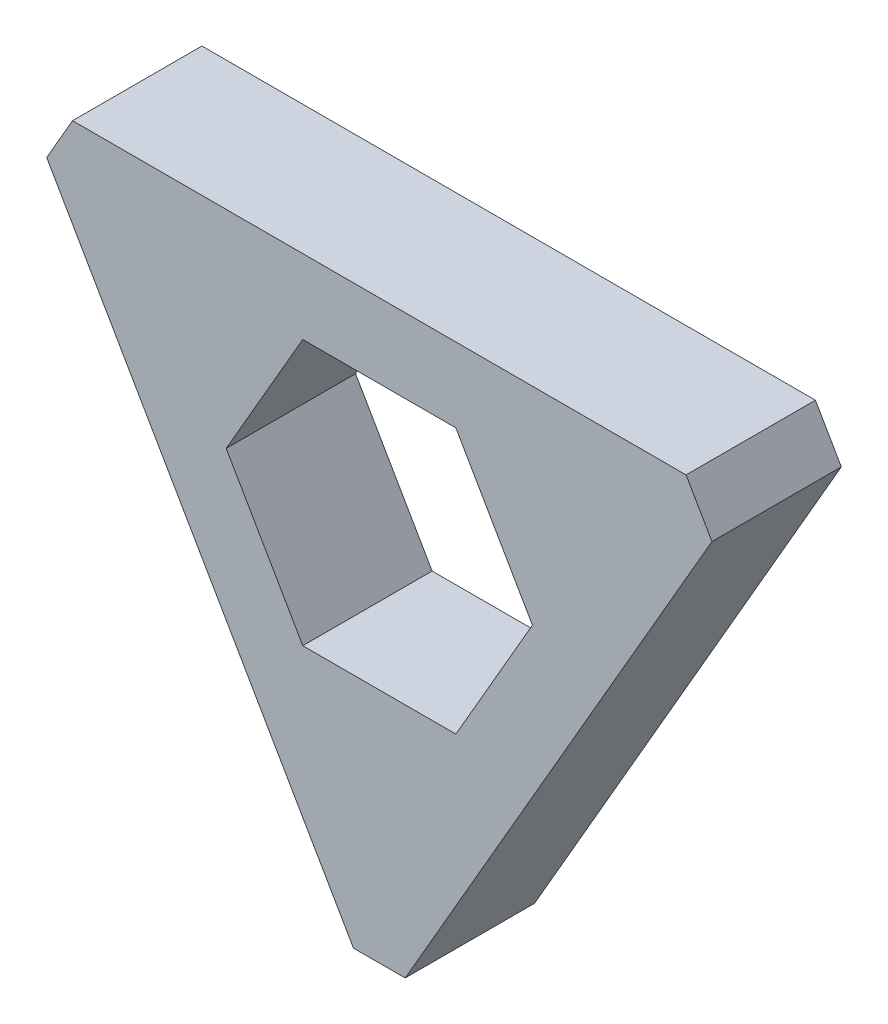
ISO-10303-21;
HEADER;
FILE_DESCRIPTION(('STEP AP214'),'2;1');
FILE_NAME('part.step','',(''),(''),'','','');
FILE_SCHEMA(('AUTOMOTIVE_DESIGN { 1 0 10303 214 1 1 1 1 }'));
ENDSEC;
DATA;
#1=APPLICATION_CONTEXT('core data for automotive mechanical design processes');
#2=APPLICATION_PROTOCOL_DEFINITION('international standard','automotive_design',2000,#1);
#3=PRODUCT_CONTEXT('',#1,'mechanical');
#4=PRODUCT('Part','Part','',(#3));
#5=PRODUCT_RELATED_PRODUCT_CATEGORY('part','',(#4));
#6=PRODUCT_DEFINITION_FORMATION('','',#4);
#7=PRODUCT_DEFINITION_CONTEXT('part definition',#1,'design');
#8=PRODUCT_DEFINITION('design','',#6,#7);
#9=PRODUCT_DEFINITION_SHAPE('','',#8);
#10=(LENGTH_UNIT() NAMED_UNIT(*) SI_UNIT(.MILLI.,.METRE.));
#11=(NAMED_UNIT(*) PLANE_ANGLE_UNIT() SI_UNIT($,.RADIAN.));
#12=(NAMED_UNIT(*) SI_UNIT($,.STERADIAN.) SOLID_ANGLE_UNIT());
#13=UNCERTAINTY_MEASURE_WITH_UNIT(LENGTH_MEASURE(1.E-05),#10,'distance_accuracy_value','');
#14=(GEOMETRIC_REPRESENTATION_CONTEXT(3) GLOBAL_UNCERTAINTY_ASSIGNED_CONTEXT((#13)) GLOBAL_UNIT_ASSIGNED_CONTEXT((#10,
#11,#12)) REPRESENTATION_CONTEXT('',''));
#15=CARTESIAN_POINT('',(0.,0.,0.));
#16=DIRECTION('',(0.,0.,1.));
#17=DIRECTION('',(1.,0.,0.));
#18=AXIS2_PLACEMENT_3D('',#15,#16,#17);
#19=CARTESIAN_POINT('',(0.,0.,-180.));
#20=DIRECTION('',(0.,0.,-1.));
#21=DIRECTION('',(-1.,0.,0.));
#22=AXIS2_PLACEMENT_3D('',#19,#20,#21);
#23=PLANE('',#22);
#24=DIRECTION('',(-0.5,-0.866025403784439,0.));
#25=VECTOR('',#24,1.);
#26=CARTESIAN_POINT('',(23.6713610367747,0.,-180.));
#27=LINE('',#26,#25);
#28=CARTESIAN_POINT('',(23.6713610367747,0.,-180.));
#29=VERTEX_POINT('',#28);
#30=CARTESIAN_POINT('',(11.8356805183873,-20.5,-180.));
#31=VERTEX_POINT('',#30);
#32=EDGE_CURVE('E224',#29,#31,#27,.T.);
#33=ORIENTED_EDGE('',*,*,#32,.T.);
#34=DIRECTION('',(-1.,0.,0.));
#35=VECTOR('',#34,1.);
#36=CARTESIAN_POINT('',(11.8356805183873,-20.5,-180.));
#37=LINE('',#36,#35);
#38=CARTESIAN_POINT('',(-11.8356805183873,-20.5,-180.));
#39=VERTEX_POINT('',#38);
#40=EDGE_CURVE('E227',#31,#39,#37,.T.);
#41=ORIENTED_EDGE('',*,*,#40,.T.);
#42=DIRECTION('',(-0.5,0.866025403784438,0.));
#43=VECTOR('',#42,1.);
#44=CARTESIAN_POINT('',(-11.8356805183873,-20.5,-180.));
#45=LINE('',#44,#43);
#46=CARTESIAN_POINT('',(-23.6713610367747,0.,-180.));
#47=VERTEX_POINT('',#46);
#48=EDGE_CURVE('E230',#39,#47,#45,.T.);
#49=ORIENTED_EDGE('',*,*,#48,.T.);
#50=DIRECTION('',(0.5,0.866025403784439,0.));
#51=VECTOR('',#50,1.);
#52=CARTESIAN_POINT('',(-23.6713610367747,0.,-180.));
#53=LINE('',#52,#51);
#54=CARTESIAN_POINT('',(-11.8356805183874,20.5,-180.));
#55=VERTEX_POINT('',#54);
#56=EDGE_CURVE('E233',#47,#55,#53,.T.);
#57=ORIENTED_EDGE('',*,*,#56,.T.);
#58=DIRECTION('',(1.,0.,0.));
#59=VECTOR('',#58,1.);
#60=CARTESIAN_POINT('',(-11.8356805183874,20.5,-180.));
#61=LINE('',#60,#59);
#62=CARTESIAN_POINT('',(11.8356805183873,20.5,-180.));
#63=VERTEX_POINT('',#62);
#64=EDGE_CURVE('E236',#55,#63,#61,.T.);
#65=ORIENTED_EDGE('',*,*,#64,.T.);
#66=DIRECTION('',(0.5,-0.866025403784439,0.));
#67=VECTOR('',#66,1.);
#68=CARTESIAN_POINT('',(11.8356805183873,20.5,-180.));
#69=LINE('',#68,#67);
#70=EDGE_CURVE('E239',#63,#29,#69,.T.);
#71=ORIENTED_EDGE('',*,*,#70,.T.);
#72=EDGE_LOOP('',(#33,#41,#49,#57,#65,#71));
#73=FACE_BOUND('',#72,.T.);
#74=DIRECTION('',(0.500000000000001,0.866025403784438,0.));
#75=VECTOR('',#74,1.);
#76=CARTESIAN_POINT('',(4.00002711889661,-57.0720970525392,-180.));
#77=LINE('',#76,#75);
#78=CARTESIAN_POINT('',(4.00002711889663,-57.0720970525392,-180.));
#79=VERTEX_POINT('',#78);
#80=CARTESIAN_POINT('',(51.4258100782776,25.0717686218424,-180.));
#81=VERTEX_POINT('',#80);
#82=EDGE_CURVE('E147',#79,#81,#77,.T.);
#83=ORIENTED_EDGE('',*,*,#82,.T.);
#84=DIRECTION('',(-0.499999910244853,0.866025455604591,0.));
#85=VECTOR('',#84,1.);
#86=CARTESIAN_POINT('',(47.4258047104851,31.9999828076548,-180.));
#87=LINE('',#86,#85);
#88=CARTESIAN_POINT('',(47.4258047104851,31.9999828076548,-180.));
#89=VERTEX_POINT('',#88);
#90=EDGE_CURVE('E142',#81,#89,#87,.T.);
#91=ORIENTED_EDGE('',*,*,#90,.T.);
#92=DIRECTION('',(-1.,0.,0.));
#93=VECTOR('',#92,1.);
#94=CARTESIAN_POINT('',(47.4258047104851,31.9999828076548,-180.));
#95=LINE('',#94,#93);
#96=CARTESIAN_POINT('',(-47.4255638428803,31.9999828076547,-180.));
#97=VERTEX_POINT('',#96);
#98=EDGE_CURVE('E140',#89,#97,#95,.T.);
#99=ORIENTED_EDGE('',*,*,#98,.T.);
#100=DIRECTION('',(-0.500034807579477,-0.866005306686371,0.));
#101=VECTOR('',#100,1.);
#102=CARTESIAN_POINT('',(-51.4258483825629,25.0719298259231,-180.));
#103=LINE('',#102,#101);
#104=CARTESIAN_POINT('',(-51.4258483825629,25.0719298259231,-180.));
#105=VERTEX_POINT('',#104);
#106=EDGE_CURVE('E47',#97,#105,#103,.T.);
#107=ORIENTED_EDGE('',*,*,#106,.T.);
#108=DIRECTION('',(0.5,-0.866025403784438,0.));
#109=VECTOR('',#108,1.);
#110=CARTESIAN_POINT('',(-51.4258483825629,25.0719298259231,-180.));
#111=LINE('',#110,#109);
#112=CARTESIAN_POINT('',(-3.99997235196278,-57.0720970525392,-180.));
#113=VERTEX_POINT('',#112);
#114=EDGE_CURVE('E222',#105,#113,#111,.T.);
#115=ORIENTED_EDGE('',*,*,#114,.T.);
#116=DIRECTION('',(1.,0.,0.));
#117=VECTOR('',#116,1.);
#118=CARTESIAN_POINT('',(4.00002711889663,-57.0720970525392,-180.));
#119=LINE('',#118,#117);
#120=EDGE_CURVE('E138',#113,#79,#119,.T.);
#121=ORIENTED_EDGE('',*,*,#120,.T.);
#122=EDGE_LOOP('',(#83,#91,#99,#107,#115,#121));
#123=FACE_BOUND('',#122,.T.);
#124=ADVANCED_FACE('F43',(#73,#123),#23,.F.);
#125=CARTESIAN_POINT('',(0.,0.,-200.));
#126=DIRECTION('',(0.,0.,-1.));
#127=DIRECTION('',(-1.,0.,0.));
#128=AXIS2_PLACEMENT_3D('',#125,#126,#127);
#129=PLANE('',#128);
#130=DIRECTION('',(0.500000000000001,0.866025403784438,0.));
#131=VECTOR('',#130,1.);
#132=CARTESIAN_POINT('',(4.00002711889661,-57.0720970525392,-200.));
#133=LINE('',#132,#131);
#134=CARTESIAN_POINT('',(4.00002711889663,-57.0720970525392,-200.));
#135=VERTEX_POINT('',#134);
#136=CARTESIAN_POINT('',(51.4258100782776,25.0717686218424,-200.));
#137=VERTEX_POINT('',#136);
#138=EDGE_CURVE('E151',#135,#137,#133,.T.);
#139=ORIENTED_EDGE('',*,*,#138,.F.);
#140=DIRECTION('',(1.,0.,0.));
#141=VECTOR('',#140,1.);
#142=CARTESIAN_POINT('',(4.00002711889663,-57.0720970525392,-200.));
#143=LINE('',#142,#141);
#144=CARTESIAN_POINT('',(-3.99997235196278,-57.0720970525392,-200.));
#145=VERTEX_POINT('',#144);
#146=EDGE_CURVE('E178',#145,#135,#143,.T.);
#147=ORIENTED_EDGE('',*,*,#146,.F.);
#148=DIRECTION('',(0.5,-0.866025403784438,0.));
#149=VECTOR('',#148,1.);
#150=CARTESIAN_POINT('',(-51.4258483825629,25.0719298259231,-200.));
#151=LINE('',#150,#149);
#152=CARTESIAN_POINT('',(-51.4258483825629,25.0719298259231,-200.));
#153=VERTEX_POINT('',#152);
#154=EDGE_CURVE('E154',#153,#145,#151,.T.);
#155=ORIENTED_EDGE('',*,*,#154,.F.);
#156=DIRECTION('',(-0.500034807579477,-0.866005306686371,0.));
#157=VECTOR('',#156,1.);
#158=CARTESIAN_POINT('',(-51.4258483825629,25.0719298259231,-200.));
#159=LINE('',#158,#157);
#160=CARTESIAN_POINT('',(-47.4255638428803,31.9999828076547,-200.));
#161=VERTEX_POINT('',#160);
#162=EDGE_CURVE('E61',#161,#153,#159,.T.);
#163=ORIENTED_EDGE('',*,*,#162,.F.);
#164=DIRECTION('',(-1.,0.,0.));
#165=VECTOR('',#164,1.);
#166=CARTESIAN_POINT('',(47.4258047104851,31.9999828076548,-200.));
#167=LINE('',#166,#165);
#168=CARTESIAN_POINT('',(47.4258047104851,31.9999828076548,-200.));
#169=VERTEX_POINT('',#168);
#170=EDGE_CURVE('E146',#169,#161,#167,.T.);
#171=ORIENTED_EDGE('',*,*,#170,.F.);
#172=DIRECTION('',(-0.499999910244853,0.866025455604591,0.));
#173=VECTOR('',#172,1.);
#174=CARTESIAN_POINT('',(47.4258047104851,31.9999828076548,-200.));
#175=LINE('',#174,#173);
#176=EDGE_CURVE('E176',#137,#169,#175,.T.);
#177=ORIENTED_EDGE('',*,*,#176,.F.);
#178=EDGE_LOOP('',(#139,#147,#155,#163,#171,#177));
#179=FACE_BOUND('',#178,.T.);
#180=DIRECTION('',(-0.5,-0.866025403784439,0.));
#181=VECTOR('',#180,1.);
#182=CARTESIAN_POINT('',(23.6713610367747,0.,-200.));
#183=LINE('',#182,#181);
#184=CARTESIAN_POINT('',(23.6713610367747,0.,-200.));
#185=VERTEX_POINT('',#184);
#186=CARTESIAN_POINT('',(11.8356805183873,-20.5,-200.));
#187=VERTEX_POINT('',#186);
#188=EDGE_CURVE('E159',#185,#187,#183,.T.);
#189=ORIENTED_EDGE('',*,*,#188,.F.);
#190=DIRECTION('',(0.5,-0.866025403784439,0.));
#191=VECTOR('',#190,1.);
#192=CARTESIAN_POINT('',(11.8356805183873,20.5,-200.));
#193=LINE('',#192,#191);
#194=CARTESIAN_POINT('',(11.8356805183873,20.5,-200.));
#195=VERTEX_POINT('',#194);
#196=EDGE_CURVE('E174',#195,#185,#193,.T.);
#197=ORIENTED_EDGE('',*,*,#196,.F.);
#198=DIRECTION('',(1.,0.,0.));
#199=VECTOR('',#198,1.);
#200=CARTESIAN_POINT('',(-11.8356805183874,20.5,-200.));
#201=LINE('',#200,#199);
#202=CARTESIAN_POINT('',(-11.8356805183874,20.5,-200.));
#203=VERTEX_POINT('',#202);
#204=EDGE_CURVE('E171',#203,#195,#201,.T.);
#205=ORIENTED_EDGE('',*,*,#204,.F.);
#206=DIRECTION('',(0.5,0.866025403784439,0.));
#207=VECTOR('',#206,1.);
#208=CARTESIAN_POINT('',(-23.6713610367747,0.,-200.));
#209=LINE('',#208,#207);
#210=CARTESIAN_POINT('',(-23.6713610367747,0.,-200.));
#211=VERTEX_POINT('',#210);
#212=EDGE_CURVE('E168',#211,#203,#209,.T.);
#213=ORIENTED_EDGE('',*,*,#212,.F.);
#214=DIRECTION('',(-0.5,0.866025403784438,0.));
#215=VECTOR('',#214,1.);
#216=CARTESIAN_POINT('',(-11.8356805183873,-20.5,-200.));
#217=LINE('',#216,#215);
#218=CARTESIAN_POINT('',(-11.8356805183873,-20.5,-200.));
#219=VERTEX_POINT('',#218);
#220=EDGE_CURVE('E165',#219,#211,#217,.T.);
#221=ORIENTED_EDGE('',*,*,#220,.F.);
#222=DIRECTION('',(-1.,0.,0.));
#223=VECTOR('',#222,1.);
#224=CARTESIAN_POINT('',(11.8356805183873,-20.5,-200.));
#225=LINE('',#224,#223);
#226=EDGE_CURVE('E162',#187,#219,#225,.T.);
#227=ORIENTED_EDGE('',*,*,#226,.F.);
#228=EDGE_LOOP('',(#189,#197,#205,#213,#221,#227));
#229=FACE_BOUND('',#228,.T.);
#230=ADVANCED_FACE('F250',(#179,#229),#129,.T.);
#231=CARTESIAN_POINT('',(4.00002711889661,-57.0720970525392,0.));
#232=DIRECTION('',(0.866025403784437,-0.5,0.));
#233=DIRECTION('',(0.,0.,-1.));
#234=AXIS2_PLACEMENT_3D('',#231,#232,#233);
#235=PLANE('',#234);
#236=ORIENTED_EDGE('',*,*,#82,.F.);
#237=DIRECTION('',(0.,0.,-1.));
#238=VECTOR('',#237,1.);
#239=CARTESIAN_POINT('',(4.00002711889663,-57.0720970525392,-140.));
#240=LINE('',#239,#238);
#241=EDGE_CURVE('E188',#79,#135,#240,.T.);
#242=ORIENTED_EDGE('',*,*,#241,.T.);
#243=ORIENTED_EDGE('',*,*,#138,.T.);
#244=DIRECTION('',(0.,0.,-1.));
#245=VECTOR('',#244,1.);
#246=CARTESIAN_POINT('',(51.4258100782776,25.0717686218424,-140.));
#247=LINE('',#246,#245);
#248=EDGE_CURVE('E192',#81,#137,#247,.T.);
#249=ORIENTED_EDGE('',*,*,#248,.F.);
#250=EDGE_LOOP('',(#236,#242,#243,#249));
#251=FACE_BOUND('',#250,.T.);
#252=ADVANCED_FACE('F247',(#251),#235,.T.);
#253=CARTESIAN_POINT('',(-51.4258483825629,25.0719298259231,0.));
#254=DIRECTION('',(-0.866025403784438,-0.5,0.));
#255=DIRECTION('',(-0.5,0.866025403784438,0.));
#256=AXIS2_PLACEMENT_3D('',#253,#254,#255);
#257=PLANE('',#256);
#258=ORIENTED_EDGE('',*,*,#114,.F.);
#259=DIRECTION('',(0.,0.,-1.));
#260=VECTOR('',#259,1.);
#261=CARTESIAN_POINT('',(-51.4258483825629,25.0719298259231,-140.));
#262=LINE('',#261,#260);
#263=EDGE_CURVE('E53',#105,#153,#262,.T.);
#264=ORIENTED_EDGE('',*,*,#263,.T.);
#265=ORIENTED_EDGE('',*,*,#154,.T.);
#266=DIRECTION('',(0.,0.,-1.));
#267=VECTOR('',#266,1.);
#268=CARTESIAN_POINT('',(-3.99997235196278,-57.0720970525392,-140.));
#269=LINE('',#268,#267);
#270=EDGE_CURVE('E184',#113,#145,#269,.T.);
#271=ORIENTED_EDGE('',*,*,#270,.F.);
#272=EDGE_LOOP('',(#258,#264,#265,#271));
#273=FACE_BOUND('',#272,.T.);
#274=ADVANCED_FACE('F277',(#273),#257,.T.);
#275=CARTESIAN_POINT('',(47.4258047104851,31.9999828076548,0.));
#276=DIRECTION('',(0.,1.,0.));
#277=DIRECTION('',(1.,0.,0.));
#278=AXIS2_PLACEMENT_3D('',#275,#276,#277);
#279=PLANE('',#278);
#280=ORIENTED_EDGE('',*,*,#98,.F.);
#281=DIRECTION('',(0.,0.,-1.));
#282=VECTOR('',#281,1.);
#283=CARTESIAN_POINT('',(47.4258047104851,31.9999828076548,-140.));
#284=LINE('',#283,#282);
#285=EDGE_CURVE('E150',#89,#169,#284,.T.);
#286=ORIENTED_EDGE('',*,*,#285,.T.);
#287=ORIENTED_EDGE('',*,*,#170,.T.);
#288=DIRECTION('',(0.,0.,-1.));
#289=VECTOR('',#288,1.);
#290=CARTESIAN_POINT('',(-47.4255638428803,31.9999828076547,-140.));
#291=LINE('',#290,#289);
#292=EDGE_CURVE('E11',#97,#161,#291,.T.);
#293=ORIENTED_EDGE('',*,*,#292,.F.);
#294=EDGE_LOOP('',(#280,#286,#287,#293));
#295=FACE_BOUND('',#294,.T.);
#296=ADVANCED_FACE('F149',(#295),#279,.T.);
#297=CARTESIAN_POINT('',(-51.4258483825629,25.0719298259231,-140.));
#298=DIRECTION('',(-0.866005306686371,0.500034807579477,0.));
#299=DIRECTION('',(0.,0.,1.));
#300=AXIS2_PLACEMENT_3D('',#297,#298,#299);
#301=PLANE('',#300);
#302=ORIENTED_EDGE('',*,*,#106,.F.);
#303=ORIENTED_EDGE('',*,*,#292,.T.);
#304=ORIENTED_EDGE('',*,*,#162,.T.);
#305=ORIENTED_EDGE('',*,*,#263,.F.);
#306=EDGE_LOOP('',(#302,#303,#304,#305));
#307=FACE_BOUND('',#306,.T.);
#308=ADVANCED_FACE('F133',(#307),#301,.T.);
#309=CARTESIAN_POINT('',(4.00002711889663,-57.0720970525392,-140.));
#310=DIRECTION('',(0.,-1.,0.));
#311=DIRECTION('',(0.,0.,-1.));
#312=AXIS2_PLACEMENT_3D('',#309,#310,#311);
#313=PLANE('',#312);
#314=ORIENTED_EDGE('',*,*,#120,.F.);
#315=ORIENTED_EDGE('',*,*,#270,.T.);
#316=ORIENTED_EDGE('',*,*,#146,.T.);
#317=ORIENTED_EDGE('',*,*,#241,.F.);
#318=EDGE_LOOP('',(#314,#315,#316,#317));
#319=FACE_BOUND('',#318,.T.);
#320=ADVANCED_FACE('F248',(#319),#313,.T.);
#321=CARTESIAN_POINT('',(47.4258047104851,31.9999828076548,-140.));
#322=DIRECTION('',(0.866025455604591,0.499999910244853,0.));
#323=DIRECTION('',(0.,0.,-1.));
#324=AXIS2_PLACEMENT_3D('',#321,#322,#323);
#325=PLANE('',#324);
#326=ORIENTED_EDGE('',*,*,#90,.F.);
#327=ORIENTED_EDGE('',*,*,#248,.T.);
#328=ORIENTED_EDGE('',*,*,#176,.T.);
#329=ORIENTED_EDGE('',*,*,#285,.F.);
#330=EDGE_LOOP('',(#326,#327,#328,#329));
#331=FACE_BOUND('',#330,.T.);
#332=ADVANCED_FACE('F253',(#331),#325,.T.);
#333=CARTESIAN_POINT('',(11.8356805183873,-20.5,-140.));
#334=DIRECTION('',(0.,1.,0.));
#335=DIRECTION('',(1.,0.,0.));
#336=AXIS2_PLACEMENT_3D('',#333,#334,#335);
#337=PLANE('',#336);
#338=ORIENTED_EDGE('',*,*,#40,.F.);
#339=DIRECTION('',(0.,0.,1.));
#340=VECTOR('',#339,1.);
#341=CARTESIAN_POINT('',(11.8356805183873,-20.5,-140.));
#342=LINE('',#341,#340);
#343=EDGE_CURVE('E180',#187,#31,#342,.T.);
#344=ORIENTED_EDGE('',*,*,#343,.F.);
#345=ORIENTED_EDGE('',*,*,#226,.T.);
#346=DIRECTION('',(0.,0.,-1.));
#347=VECTOR('',#346,1.);
#348=CARTESIAN_POINT('',(-11.8356805183873,-20.5,-140.));
#349=LINE('',#348,#347);
#350=EDGE_CURVE('E214',#39,#219,#349,.T.);
#351=ORIENTED_EDGE('',*,*,#350,.F.);
#352=EDGE_LOOP('',(#338,#344,#345,#351));
#353=FACE_BOUND('',#352,.T.);
#354=ADVANCED_FACE('F255',(#353),#337,.T.);
#355=CARTESIAN_POINT('',(-11.8356805183873,-20.5,-140.));
#356=DIRECTION('',(0.866025403784438,0.5,0.));
#357=DIRECTION('',(0.,0.,-1.));
#358=AXIS2_PLACEMENT_3D('',#355,#356,#357);
#359=PLANE('',#358);
#360=ORIENTED_EDGE('',*,*,#48,.F.);
#361=ORIENTED_EDGE('',*,*,#350,.T.);
#362=ORIENTED_EDGE('',*,*,#220,.T.);
#363=DIRECTION('',(0.,0.,-1.));
#364=VECTOR('',#363,1.);
#365=CARTESIAN_POINT('',(-23.6713610367747,0.,-140.));
#366=LINE('',#365,#364);
#367=EDGE_CURVE('E210',#47,#211,#366,.T.);
#368=ORIENTED_EDGE('',*,*,#367,.F.);
#369=EDGE_LOOP('',(#360,#361,#362,#368));
#370=FACE_BOUND('',#369,.T.);
#371=ADVANCED_FACE('F262',(#370),#359,.T.);
#372=CARTESIAN_POINT('',(-23.6713610367747,0.,-140.));
#373=DIRECTION('',(0.866025403784439,-0.5,0.));
#374=DIRECTION('',(0.,0.,-1.));
#375=AXIS2_PLACEMENT_3D('',#372,#373,#374);
#376=PLANE('',#375);
#377=ORIENTED_EDGE('',*,*,#56,.F.);
#378=ORIENTED_EDGE('',*,*,#367,.T.);
#379=ORIENTED_EDGE('',*,*,#212,.T.);
#380=DIRECTION('',(0.,0.,-1.));
#381=VECTOR('',#380,1.);
#382=CARTESIAN_POINT('',(-11.8356805183874,20.5,-140.));
#383=LINE('',#382,#381);
#384=EDGE_CURVE('E206',#55,#203,#383,.T.);
#385=ORIENTED_EDGE('',*,*,#384,.F.);
#386=EDGE_LOOP('',(#377,#378,#379,#385));
#387=FACE_BOUND('',#386,.T.);
#388=ADVANCED_FACE('F316',(#387),#376,.T.);
#389=CARTESIAN_POINT('',(23.6713610367747,0.,-140.));
#390=DIRECTION('',(-0.866025403784439,0.5,0.));
#391=DIRECTION('',(0.,0.,1.));
#392=AXIS2_PLACEMENT_3D('',#389,#390,#391);
#393=PLANE('',#392);
#394=ORIENTED_EDGE('',*,*,#32,.F.);
#395=DIRECTION('',(0.,0.,-1.));
#396=VECTOR('',#395,1.);
#397=CARTESIAN_POINT('',(23.6713610367747,0.,-140.));
#398=LINE('',#397,#396);
#399=EDGE_CURVE('E198',#29,#185,#398,.T.);
#400=ORIENTED_EDGE('',*,*,#399,.T.);
#401=ORIENTED_EDGE('',*,*,#188,.T.);
#402=ORIENTED_EDGE('',*,*,#343,.T.);
#403=EDGE_LOOP('',(#394,#400,#401,#402));
#404=FACE_BOUND('',#403,.T.);
#405=ADVANCED_FACE('F327',(#404),#393,.T.);
#406=CARTESIAN_POINT('',(-11.8356805183874,20.5,-140.));
#407=DIRECTION('',(0.,-1.,0.));
#408=DIRECTION('',(0.,0.,-1.));
#409=AXIS2_PLACEMENT_3D('',#406,#407,#408);
#410=PLANE('',#409);
#411=ORIENTED_EDGE('',*,*,#64,.F.);
#412=ORIENTED_EDGE('',*,*,#384,.T.);
#413=ORIENTED_EDGE('',*,*,#204,.T.);
#414=DIRECTION('',(0.,0.,-1.));
#415=VECTOR('',#414,1.);
#416=CARTESIAN_POINT('',(11.8356805183873,20.5,-140.));
#417=LINE('',#416,#415);
#418=EDGE_CURVE('E202',#63,#195,#417,.T.);
#419=ORIENTED_EDGE('',*,*,#418,.F.);
#420=EDGE_LOOP('',(#411,#412,#413,#419));
#421=FACE_BOUND('',#420,.T.);
#422=ADVANCED_FACE('F338',(#421),#410,.T.);
#423=CARTESIAN_POINT('',(11.8356805183873,20.5,-140.));
#424=DIRECTION('',(-0.866025403784439,-0.5,0.));
#425=DIRECTION('',(-0.5,0.866025403784439,0.));
#426=AXIS2_PLACEMENT_3D('',#423,#424,#425);
#427=PLANE('',#426);
#428=ORIENTED_EDGE('',*,*,#70,.F.);
#429=ORIENTED_EDGE('',*,*,#418,.T.);
#430=ORIENTED_EDGE('',*,*,#196,.T.);
#431=ORIENTED_EDGE('',*,*,#399,.F.);
#432=EDGE_LOOP('',(#428,#429,#430,#431));
#433=FACE_BOUND('',#432,.T.);
#434=ADVANCED_FACE('F45',(#433),#427,.T.);
#435=CLOSED_SHELL('',(#124,#230,#252,#274,#296,#308,#320,#332,#354,#371,#388,#405,#422,#434));
#436=MANIFOLD_SOLID_BREP('B2',#435);
#437=ADVANCED_BREP_SHAPE_REPRESENTATION('',(#18,#436),#14);
#438=SHAPE_DEFINITION_REPRESENTATION(#9,#437);
ENDSEC;
END-ISO-10303-21;
